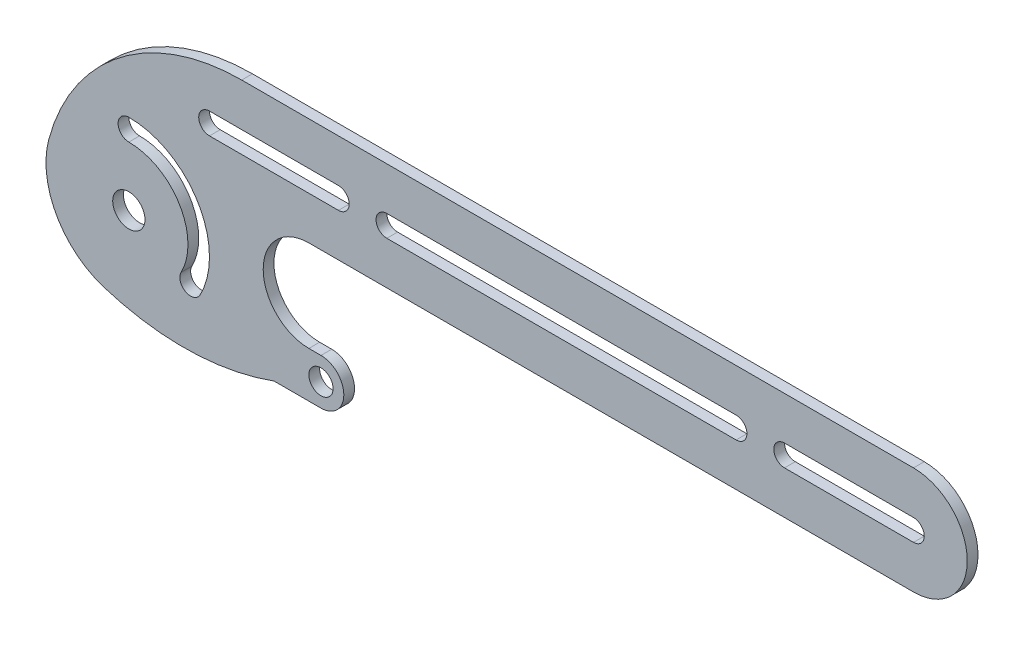
ISO-10303-21;
HEADER;
FILE_DESCRIPTION(('STEP AP214'),'2;1');
FILE_NAME('part.step','',(''),(''),'','','');
FILE_SCHEMA(('AUTOMOTIVE_DESIGN { 1 0 10303 214 1 1 1 1 }'));
ENDSEC;
DATA;
#1=APPLICATION_CONTEXT('core data for automotive mechanical design processes');
#2=APPLICATION_PROTOCOL_DEFINITION('international standard','automotive_design',2000,#1);
#3=PRODUCT_CONTEXT('',#1,'mechanical');
#4=PRODUCT('Part','Part','',(#3));
#5=PRODUCT_RELATED_PRODUCT_CATEGORY('part','',(#4));
#6=PRODUCT_DEFINITION_FORMATION('','',#4);
#7=PRODUCT_DEFINITION_CONTEXT('part definition',#1,'design');
#8=PRODUCT_DEFINITION('design','',#6,#7);
#9=PRODUCT_DEFINITION_SHAPE('','',#8);
#10=(LENGTH_UNIT() NAMED_UNIT(*) SI_UNIT(.MILLI.,.METRE.));
#11=(NAMED_UNIT(*) PLANE_ANGLE_UNIT() SI_UNIT($,.RADIAN.));
#12=(NAMED_UNIT(*) SI_UNIT($,.STERADIAN.) SOLID_ANGLE_UNIT());
#13=UNCERTAINTY_MEASURE_WITH_UNIT(LENGTH_MEASURE(1.E-05),#10,'distance_accuracy_value','');
#14=(GEOMETRIC_REPRESENTATION_CONTEXT(3) GLOBAL_UNCERTAINTY_ASSIGNED_CONTEXT((#13)) GLOBAL_UNIT_ASSIGNED_CONTEXT((#10,
#11,#12)) REPRESENTATION_CONTEXT('',''));
#15=CARTESIAN_POINT('',(0.,0.,0.));
#16=DIRECTION('',(0.,0.,1.));
#17=DIRECTION('',(1.,0.,0.));
#18=AXIS2_PLACEMENT_3D('',#15,#16,#17);
#19=CARTESIAN_POINT('',(21.,-5.67307692307691,1.));
#20=DIRECTION('',(0.,0.,-1.));
#21=DIRECTION('',(-1.,0.,0.));
#22=AXIS2_PLACEMENT_3D('',#19,#20,#21);
#23=PLANE('',#22);
#24=CARTESIAN_POINT('',(122.,21.4999999999999,1.));
#25=DIRECTION('',(0.,0.,1.));
#26=DIRECTION('',(1.,0.,0.));
#27=AXIS2_PLACEMENT_3D('',#24,#25,#26);
#28=CIRCLE('',#27,2.);
#29=CARTESIAN_POINT('',(122.,23.4999999999999,1.));
#30=VERTEX_POINT('',#29);
#31=CARTESIAN_POINT('',(122.,19.5,1.));
#32=VERTEX_POINT('',#31);
#33=EDGE_CURVE('E245',#30,#32,#28,.T.);
#34=ORIENTED_EDGE('',*,*,#33,.F.);
#35=DIRECTION('',(-1.,0.,0.));
#36=VECTOR('',#35,1.);
#37=CARTESIAN_POINT('',(122.,23.4999999999999,1.));
#38=LINE('',#37,#36);
#39=CARTESIAN_POINT('',(146.,23.4999999999999,1.));
#40=VERTEX_POINT('',#39);
#41=EDGE_CURVE('E253',#40,#30,#38,.T.);
#42=ORIENTED_EDGE('',*,*,#41,.F.);
#43=CARTESIAN_POINT('',(146.,21.4999999999999,1.));
#44=DIRECTION('',(0.,0.,1.));
#45=DIRECTION('',(1.,0.,0.));
#46=AXIS2_PLACEMENT_3D('',#43,#44,#45);
#47=CIRCLE('',#46,2.);
#48=CARTESIAN_POINT('',(146.,19.4999999999999,1.));
#49=VERTEX_POINT('',#48);
#50=EDGE_CURVE('E250',#49,#40,#47,.T.);
#51=ORIENTED_EDGE('',*,*,#50,.F.);
#52=DIRECTION('',(1.,0.,0.));
#53=VECTOR('',#52,1.);
#54=CARTESIAN_POINT('',(122.,19.5,1.));
#55=LINE('',#54,#53);
#56=EDGE_CURVE('E247',#32,#49,#55,.T.);
#57=ORIENTED_EDGE('',*,*,#56,.F.);
#58=EDGE_LOOP('',(#34,#42,#51,#57));
#59=FACE_BOUND('',#58,.T.);
#60=CARTESIAN_POINT('',(15.,21.5,1.));
#61=DIRECTION('',(0.,0.,1.));
#62=DIRECTION('',(1.,0.,0.));
#63=AXIS2_PLACEMENT_3D('',#60,#61,#62);
#64=CIRCLE('',#63,2.);
#65=CARTESIAN_POINT('',(15.,23.5,1.));
#66=VERTEX_POINT('',#65);
#67=CARTESIAN_POINT('',(15.,19.5,1.));
#68=VERTEX_POINT('',#67);
#69=EDGE_CURVE('E307',#66,#68,#64,.T.);
#70=ORIENTED_EDGE('',*,*,#69,.F.);
#71=DIRECTION('',(-1.,0.,0.));
#72=VECTOR('',#71,1.);
#73=CARTESIAN_POINT('',(15.,23.5,1.));
#74=LINE('',#73,#72);
#75=CARTESIAN_POINT('',(39.,23.5,1.));
#76=VERTEX_POINT('',#75);
#77=EDGE_CURVE('E315',#76,#66,#74,.T.);
#78=ORIENTED_EDGE('',*,*,#77,.F.);
#79=CARTESIAN_POINT('',(39.,21.5,1.));
#80=DIRECTION('',(0.,0.,1.));
#81=DIRECTION('',(1.,0.,0.));
#82=AXIS2_PLACEMENT_3D('',#79,#80,#81);
#83=CIRCLE('',#82,2.);
#84=CARTESIAN_POINT('',(39.,19.5,1.));
#85=VERTEX_POINT('',#84);
#86=EDGE_CURVE('E312',#85,#76,#83,.T.);
#87=ORIENTED_EDGE('',*,*,#86,.F.);
#88=DIRECTION('',(1.,0.,0.));
#89=VECTOR('',#88,1.);
#90=CARTESIAN_POINT('',(15.,19.5,1.));
#91=LINE('',#90,#89);
#92=EDGE_CURVE('E309',#68,#85,#91,.T.);
#93=ORIENTED_EDGE('',*,*,#92,.F.);
#94=EDGE_LOOP('',(#70,#78,#87,#93));
#95=FACE_BOUND('',#94,.T.);
#96=CARTESIAN_POINT('',(21.,-5.67307692307691,1.));
#97=DIRECTION('',(0.,0.,1.));
#98=DIRECTION('',(-1.,0.,0.));
#99=AXIS2_PLACEMENT_3D('',#96,#97,#98);
#100=CIRCLE('',#99,37.1730769230769);
#101=CARTESIAN_POINT('',(21.,31.5,1.));
#102=VERTEX_POINT('',#101);
#103=CARTESIAN_POINT('',(-14.8866459869329,4.02157561002308,1.));
#104=VERTEX_POINT('',#103);
#105=EDGE_CURVE('E350',#102,#104,#100,.T.);
#106=ORIENTED_EDGE('',*,*,#105,.T.);
#107=CARTESIAN_POINT('',(0.,0.,1.));
#108=DIRECTION('',(0.,0.,1.));
#109=DIRECTION('',(1.,0.,0.));
#110=AXIS2_PLACEMENT_3D('',#107,#108,#109);
#111=CIRCLE('',#110,15.4202885552573);
#112=CARTESIAN_POINT('',(-4.68632225256741,-14.6909388016046,1.));
#113=VERTEX_POINT('',#112);
#114=EDGE_CURVE('E353',#104,#113,#111,.T.);
#115=ORIENTED_EDGE('',*,*,#114,.T.);
#116=CARTESIAN_POINT('',(10.150187696722,31.8193624426165,1.));
#117=DIRECTION('',(0.,0.,1.));
#118=DIRECTION('',(-1.,0.,0.));
#119=AXIS2_PLACEMENT_3D('',#116,#117,#118);
#120=CIRCLE('',#119,48.8193624426165);
#121=CARTESIAN_POINT('',(27.,-14.,1.));
#122=VERTEX_POINT('',#121);
#123=EDGE_CURVE('E356',#113,#122,#120,.T.);
#124=ORIENTED_EDGE('',*,*,#123,.T.);
#125=DIRECTION('',(1.,0.,0.));
#126=VECTOR('',#125,1.);
#127=CARTESIAN_POINT('',(27.,-14.,1.));
#128=LINE('',#127,#126);
#129=CARTESIAN_POINT('',(35.75,-14.,1.));
#130=VERTEX_POINT('',#129);
#131=EDGE_CURVE('E358',#122,#130,#128,.T.);
#132=ORIENTED_EDGE('',*,*,#131,.T.);
#133=CARTESIAN_POINT('',(35.75,-9.75,1.));
#134=DIRECTION('',(0.,0.,1.));
#135=DIRECTION('',(-1.,0.,0.));
#136=AXIS2_PLACEMENT_3D('',#133,#134,#135);
#137=CIRCLE('',#136,4.25);
#138=CARTESIAN_POINT('',(35.75,-5.5,1.));
#139=VERTEX_POINT('',#138);
#140=EDGE_CURVE('E360',#130,#139,#137,.T.);
#141=ORIENTED_EDGE('',*,*,#140,.T.);
#142=DIRECTION('',(-1.,0.,0.));
#143=VECTOR('',#142,1.);
#144=CARTESIAN_POINT('',(33.5,-5.5,1.));
#145=LINE('',#144,#143);
#146=CARTESIAN_POINT('',(33.5,-5.5,1.));
#147=VERTEX_POINT('',#146);
#148=EDGE_CURVE('E362',#139,#147,#145,.T.);
#149=ORIENTED_EDGE('',*,*,#148,.T.);
#150=CARTESIAN_POINT('',(33.5,3.,1.));
#151=DIRECTION('',(0.,0.,-1.));
#152=DIRECTION('',(1.,0.,0.));
#153=AXIS2_PLACEMENT_3D('',#150,#151,#152);
#154=CIRCLE('',#153,8.5);
#155=CARTESIAN_POINT('',(33.5,11.5,1.));
#156=VERTEX_POINT('',#155);
#157=EDGE_CURVE('E364',#147,#156,#154,.T.);
#158=ORIENTED_EDGE('',*,*,#157,.T.);
#159=DIRECTION('',(1.,0.,0.));
#160=VECTOR('',#159,1.);
#161=CARTESIAN_POINT('',(146.,11.4999999999999,1.));
#162=LINE('',#161,#160);
#163=CARTESIAN_POINT('',(146.,11.4999999999999,1.));
#164=VERTEX_POINT('',#163);
#165=EDGE_CURVE('E366',#156,#164,#162,.T.);
#166=ORIENTED_EDGE('',*,*,#165,.T.);
#167=CARTESIAN_POINT('',(146.,21.4999999999999,1.));
#168=DIRECTION('',(0.,0.,1.));
#169=DIRECTION('',(-1.,0.,0.));
#170=AXIS2_PLACEMENT_3D('',#167,#168,#169);
#171=CIRCLE('',#170,10.);
#172=CARTESIAN_POINT('',(146.,31.5,1.));
#173=VERTEX_POINT('',#172);
#174=EDGE_CURVE('E368',#164,#173,#171,.T.);
#175=ORIENTED_EDGE('',*,*,#174,.T.);
#176=DIRECTION('',(-1.,0.,0.));
#177=VECTOR('',#176,1.);
#178=CARTESIAN_POINT('',(21.,31.5,1.));
#179=LINE('',#178,#177);
#180=EDGE_CURVE('E370',#173,#102,#179,.T.);
#181=ORIENTED_EDGE('',*,*,#180,.T.);
#182=EDGE_LOOP('',(#106,#115,#124,#132,#141,#149,#158,#166,#175,#181));
#183=FACE_BOUND('',#182,.T.);
#184=CARTESIAN_POINT('',(35.75,-9.75,1.));
#185=DIRECTION('',(0.,0.,1.));
#186=DIRECTION('',(1.,0.,0.));
#187=AXIS2_PLACEMENT_3D('',#184,#185,#186);
#188=CIRCLE('',#187,2.25);
#189=CARTESIAN_POINT('',(38.,-9.75,1.));
#190=VERTEX_POINT('',#189);
#191=EDGE_CURVE('E344',#190,#190,#188,.T.);
#192=ORIENTED_EDGE('',*,*,#191,.F.);
#193=EDGE_LOOP('',(#192));
#194=FACE_BOUND('',#193,.T.);
#195=CARTESIAN_POINT('',(0.,0.,1.));
#196=DIRECTION('',(0.,0.,1.));
#197=DIRECTION('',(1.,0.,0.));
#198=AXIS2_PLACEMENT_3D('',#195,#196,#197);
#199=CIRCLE('',#198,3.);
#200=CARTESIAN_POINT('',(3.,0.,1.));
#201=VERTEX_POINT('',#200);
#202=EDGE_CURVE('E338',#201,#201,#199,.T.);
#203=ORIENTED_EDGE('',*,*,#202,.F.);
#204=EDGE_LOOP('',(#203));
#205=FACE_BOUND('',#204,.T.);
#206=CARTESIAN_POINT('',(48.,21.5,1.));
#207=DIRECTION('',(0.,0.,1.));
#208=DIRECTION('',(1.,0.,0.));
#209=AXIS2_PLACEMENT_3D('',#206,#207,#208);
#210=CIRCLE('',#209,2.);
#211=CARTESIAN_POINT('',(48.,23.5,1.));
#212=VERTEX_POINT('',#211);
#213=CARTESIAN_POINT('',(48.,19.5,1.));
#214=VERTEX_POINT('',#213);
#215=EDGE_CURVE('E276',#212,#214,#210,.T.);
#216=ORIENTED_EDGE('',*,*,#215,.F.);
#217=DIRECTION('',(-1.,0.,0.));
#218=VECTOR('',#217,1.);
#219=CARTESIAN_POINT('',(48.,23.5,1.));
#220=LINE('',#219,#218);
#221=CARTESIAN_POINT('',(113.,23.5,1.));
#222=VERTEX_POINT('',#221);
#223=EDGE_CURVE('E284',#222,#212,#220,.T.);
#224=ORIENTED_EDGE('',*,*,#223,.F.);
#225=CARTESIAN_POINT('',(113.,21.4999999999999,1.));
#226=DIRECTION('',(0.,0.,1.));
#227=DIRECTION('',(1.,0.,0.));
#228=AXIS2_PLACEMENT_3D('',#225,#226,#227);
#229=CIRCLE('',#228,2.);
#230=CARTESIAN_POINT('',(113.,19.4999999999999,1.));
#231=VERTEX_POINT('',#230);
#232=EDGE_CURVE('E281',#231,#222,#229,.T.);
#233=ORIENTED_EDGE('',*,*,#232,.F.);
#234=DIRECTION('',(1.,0.,0.));
#235=VECTOR('',#234,1.);
#236=CARTESIAN_POINT('',(48.,19.5,1.));
#237=LINE('',#236,#235);
#238=EDGE_CURVE('E278',#214,#231,#237,.T.);
#239=ORIENTED_EDGE('',*,*,#238,.F.);
#240=EDGE_LOOP('',(#216,#224,#233,#239));
#241=FACE_BOUND('',#240,.T.);
#242=CARTESIAN_POINT('',(11.4976326065654,-6.06666666666667,1.));
#243=DIRECTION('',(0.,0.,1.));
#244=DIRECTION('',(1.,0.,0.));
#245=AXIS2_PLACEMENT_3D('',#242,#243,#244);
#246=CIRCLE('',#245,2.);
#247=CARTESIAN_POINT('',(9.72876605170917,-5.13333333333334,1.));
#248=VERTEX_POINT('',#247);
#249=CARTESIAN_POINT('',(13.2664991614216,-7.,1.));
#250=VERTEX_POINT('',#249);
#251=EDGE_CURVE('E209',#248,#250,#246,.T.);
#252=ORIENTED_EDGE('',*,*,#251,.F.);
#253=CARTESIAN_POINT('',(0.,0.,1.));
#254=DIRECTION('',(0.,0.,-1.));
#255=DIRECTION('',(1.,0.,0.));
#256=AXIS2_PLACEMENT_3D('',#253,#254,#255);
#257=CIRCLE('',#256,11.);
#258=CARTESIAN_POINT('',(0.,11.,1.));
#259=VERTEX_POINT('',#258);
#260=EDGE_CURVE('E231',#259,#248,#257,.T.);
#261=ORIENTED_EDGE('',*,*,#260,.F.);
#262=CARTESIAN_POINT('',(0.,13.,1.));
#263=DIRECTION('',(0.,0.,1.));
#264=DIRECTION('',(1.,0.,0.));
#265=AXIS2_PLACEMENT_3D('',#262,#263,#264);
#266=CIRCLE('',#265,2.);
#267=CARTESIAN_POINT('',(0.,15.,1.));
#268=VERTEX_POINT('',#267);
#269=EDGE_CURVE('E229',#268,#259,#266,.T.);
#270=ORIENTED_EDGE('',*,*,#269,.F.);
#271=CARTESIAN_POINT('',(0.,0.,1.));
#272=DIRECTION('',(0.,0.,1.));
#273=DIRECTION('',(1.,0.,0.));
#274=AXIS2_PLACEMENT_3D('',#271,#272,#273);
#275=CIRCLE('',#274,15.);
#276=EDGE_CURVE('E217',#250,#268,#275,.T.);
#277=ORIENTED_EDGE('',*,*,#276,.F.);
#278=EDGE_LOOP('',(#252,#261,#270,#277));
#279=FACE_BOUND('',#278,.T.);
#280=ADVANCED_FACE('F36',(#59,#95,#183,#194,#205,#241,#279),#23,.F.);
#281=CARTESIAN_POINT('',(21.,-5.67307692307691,-1.));
#282=DIRECTION('',(0.,0.,-1.));
#283=DIRECTION('',(-1.,0.,0.));
#284=AXIS2_PLACEMENT_3D('',#281,#282,#283);
#285=PLANE('',#284);
#286=CARTESIAN_POINT('',(35.75,-9.75,-1.));
#287=DIRECTION('',(0.,0.,1.));
#288=DIRECTION('',(1.,0.,0.));
#289=AXIS2_PLACEMENT_3D('',#286,#287,#288);
#290=CIRCLE('',#289,2.25);
#291=CARTESIAN_POINT('',(38.,-9.75,-1.));
#292=VERTEX_POINT('',#291);
#293=EDGE_CURVE('E341',#292,#292,#290,.T.);
#294=ORIENTED_EDGE('',*,*,#293,.T.);
#295=EDGE_LOOP('',(#294));
#296=FACE_BOUND('',#295,.T.);
#297=CARTESIAN_POINT('',(21.,-5.67307692307691,-1.));
#298=DIRECTION('',(0.,0.,1.));
#299=DIRECTION('',(-1.,0.,0.));
#300=AXIS2_PLACEMENT_3D('',#297,#298,#299);
#301=CIRCLE('',#300,37.1730769230769);
#302=CARTESIAN_POINT('',(21.,31.5,-1.));
#303=VERTEX_POINT('',#302);
#304=CARTESIAN_POINT('',(-14.8866459869329,4.02157561002308,-1.));
#305=VERTEX_POINT('',#304);
#306=EDGE_CURVE('E347',#303,#305,#301,.T.);
#307=ORIENTED_EDGE('',*,*,#306,.F.);
#308=DIRECTION('',(-1.,0.,0.));
#309=VECTOR('',#308,1.);
#310=CARTESIAN_POINT('',(21.,31.5,-1.));
#311=LINE('',#310,#309);
#312=CARTESIAN_POINT('',(146.,31.5,-1.));
#313=VERTEX_POINT('',#312);
#314=EDGE_CURVE('E354',#313,#303,#311,.T.);
#315=ORIENTED_EDGE('',*,*,#314,.F.);
#316=CARTESIAN_POINT('',(146.,21.4999999999999,-1.));
#317=DIRECTION('',(0.,0.,1.));
#318=DIRECTION('',(-1.,0.,0.));
#319=AXIS2_PLACEMENT_3D('',#316,#317,#318);
#320=CIRCLE('',#319,10.);
#321=CARTESIAN_POINT('',(146.,11.4999999999999,-1.));
#322=VERTEX_POINT('',#321);
#323=EDGE_CURVE('E389',#322,#313,#320,.T.);
#324=ORIENTED_EDGE('',*,*,#323,.F.);
#325=DIRECTION('',(1.,0.,0.));
#326=VECTOR('',#325,1.);
#327=CARTESIAN_POINT('',(146.,11.4999999999999,-1.));
#328=LINE('',#327,#326);
#329=CARTESIAN_POINT('',(33.5,11.5,-1.));
#330=VERTEX_POINT('',#329);
#331=EDGE_CURVE('E387',#330,#322,#328,.T.);
#332=ORIENTED_EDGE('',*,*,#331,.F.);
#333=CARTESIAN_POINT('',(33.5,3.,-1.));
#334=DIRECTION('',(0.,0.,-1.));
#335=DIRECTION('',(1.,0.,0.));
#336=AXIS2_PLACEMENT_3D('',#333,#334,#335);
#337=CIRCLE('',#336,8.5);
#338=CARTESIAN_POINT('',(33.5,-5.5,-1.));
#339=VERTEX_POINT('',#338);
#340=EDGE_CURVE('E385',#339,#330,#337,.T.);
#341=ORIENTED_EDGE('',*,*,#340,.F.);
#342=DIRECTION('',(-1.,0.,0.));
#343=VECTOR('',#342,1.);
#344=CARTESIAN_POINT('',(33.5,-5.5,-1.));
#345=LINE('',#344,#343);
#346=CARTESIAN_POINT('',(35.75,-5.5,-1.));
#347=VERTEX_POINT('',#346);
#348=EDGE_CURVE('E383',#347,#339,#345,.T.);
#349=ORIENTED_EDGE('',*,*,#348,.F.);
#350=CARTESIAN_POINT('',(35.75,-9.75,-1.));
#351=DIRECTION('',(0.,0.,1.));
#352=DIRECTION('',(-1.,0.,0.));
#353=AXIS2_PLACEMENT_3D('',#350,#351,#352);
#354=CIRCLE('',#353,4.25);
#355=CARTESIAN_POINT('',(35.75,-14.,-1.));
#356=VERTEX_POINT('',#355);
#357=EDGE_CURVE('E381',#356,#347,#354,.T.);
#358=ORIENTED_EDGE('',*,*,#357,.F.);
#359=DIRECTION('',(1.,0.,0.));
#360=VECTOR('',#359,1.);
#361=CARTESIAN_POINT('',(27.,-14.,-1.));
#362=LINE('',#361,#360);
#363=CARTESIAN_POINT('',(27.,-14.,-1.));
#364=VERTEX_POINT('',#363);
#365=EDGE_CURVE('E379',#364,#356,#362,.T.);
#366=ORIENTED_EDGE('',*,*,#365,.F.);
#367=CARTESIAN_POINT('',(10.150187696722,31.8193624426165,-1.));
#368=DIRECTION('',(0.,0.,1.));
#369=DIRECTION('',(-1.,0.,0.));
#370=AXIS2_PLACEMENT_3D('',#367,#368,#369);
#371=CIRCLE('',#370,48.8193624426165);
#372=CARTESIAN_POINT('',(-4.68632225256741,-14.6909388016046,-1.));
#373=VERTEX_POINT('',#372);
#374=EDGE_CURVE('E377',#373,#364,#371,.T.);
#375=ORIENTED_EDGE('',*,*,#374,.F.);
#376=CARTESIAN_POINT('',(0.,0.,-1.));
#377=DIRECTION('',(0.,0.,1.));
#378=DIRECTION('',(1.,0.,0.));
#379=AXIS2_PLACEMENT_3D('',#376,#377,#378);
#380=CIRCLE('',#379,15.4202885552573);
#381=EDGE_CURVE('E375',#305,#373,#380,.T.);
#382=ORIENTED_EDGE('',*,*,#381,.F.);
#383=EDGE_LOOP('',(#307,#315,#324,#332,#341,#349,#358,#366,#375,#382));
#384=FACE_BOUND('',#383,.T.);
#385=CARTESIAN_POINT('',(0.,0.,-1.));
#386=DIRECTION('',(0.,0.,1.));
#387=DIRECTION('',(1.,0.,0.));
#388=AXIS2_PLACEMENT_3D('',#385,#386,#387);
#389=CIRCLE('',#388,3.);
#390=CARTESIAN_POINT('',(3.,0.,-1.));
#391=VERTEX_POINT('',#390);
#392=EDGE_CURVE('E337',#391,#391,#389,.T.);
#393=ORIENTED_EDGE('',*,*,#392,.T.);
#394=EDGE_LOOP('',(#393));
#395=FACE_BOUND('',#394,.T.);
#396=DIRECTION('',(-1.,0.,0.));
#397=VECTOR('',#396,1.);
#398=CARTESIAN_POINT('',(15.,23.5,-1.));
#399=LINE('',#398,#397);
#400=CARTESIAN_POINT('',(39.,23.5,-1.));
#401=VERTEX_POINT('',#400);
#402=CARTESIAN_POINT('',(15.,23.5,-1.));
#403=VERTEX_POINT('',#402);
#404=EDGE_CURVE('E310',#401,#403,#399,.T.);
#405=ORIENTED_EDGE('',*,*,#404,.T.);
#406=CARTESIAN_POINT('',(15.,21.5,-1.));
#407=DIRECTION('',(0.,0.,1.));
#408=DIRECTION('',(1.,0.,0.));
#409=AXIS2_PLACEMENT_3D('',#406,#407,#408);
#410=CIRCLE('',#409,2.);
#411=CARTESIAN_POINT('',(15.,19.5,-1.));
#412=VERTEX_POINT('',#411);
#413=EDGE_CURVE('E306',#403,#412,#410,.T.);
#414=ORIENTED_EDGE('',*,*,#413,.T.);
#415=DIRECTION('',(1.,0.,0.));
#416=VECTOR('',#415,1.);
#417=CARTESIAN_POINT('',(15.,19.5,-1.));
#418=LINE('',#417,#416);
#419=CARTESIAN_POINT('',(39.,19.5,-1.));
#420=VERTEX_POINT('',#419);
#421=EDGE_CURVE('E320',#412,#420,#418,.T.);
#422=ORIENTED_EDGE('',*,*,#421,.T.);
#423=CARTESIAN_POINT('',(39.,21.5,-1.));
#424=DIRECTION('',(0.,0.,1.));
#425=DIRECTION('',(1.,0.,0.));
#426=AXIS2_PLACEMENT_3D('',#423,#424,#425);
#427=CIRCLE('',#426,2.);
#428=EDGE_CURVE('E323',#420,#401,#427,.T.);
#429=ORIENTED_EDGE('',*,*,#428,.T.);
#430=EDGE_LOOP('',(#405,#414,#422,#429));
#431=FACE_BOUND('',#430,.T.);
#432=DIRECTION('',(-1.,0.,0.));
#433=VECTOR('',#432,1.);
#434=CARTESIAN_POINT('',(48.,23.5,-1.));
#435=LINE('',#434,#433);
#436=CARTESIAN_POINT('',(113.,23.5,-1.));
#437=VERTEX_POINT('',#436);
#438=CARTESIAN_POINT('',(48.,23.5,-1.));
#439=VERTEX_POINT('',#438);
#440=EDGE_CURVE('E279',#437,#439,#435,.T.);
#441=ORIENTED_EDGE('',*,*,#440,.T.);
#442=CARTESIAN_POINT('',(48.,21.5,-1.));
#443=DIRECTION('',(0.,0.,1.));
#444=DIRECTION('',(1.,0.,0.));
#445=AXIS2_PLACEMENT_3D('',#442,#443,#444);
#446=CIRCLE('',#445,2.);
#447=CARTESIAN_POINT('',(48.,19.5,-1.));
#448=VERTEX_POINT('',#447);
#449=EDGE_CURVE('E275',#439,#448,#446,.T.);
#450=ORIENTED_EDGE('',*,*,#449,.T.);
#451=DIRECTION('',(1.,0.,0.));
#452=VECTOR('',#451,1.);
#453=CARTESIAN_POINT('',(48.,19.5,-1.));
#454=LINE('',#453,#452);
#455=CARTESIAN_POINT('',(113.,19.4999999999999,-1.));
#456=VERTEX_POINT('',#455);
#457=EDGE_CURVE('E289',#448,#456,#454,.T.);
#458=ORIENTED_EDGE('',*,*,#457,.T.);
#459=CARTESIAN_POINT('',(113.,21.4999999999999,-1.));
#460=DIRECTION('',(0.,0.,1.));
#461=DIRECTION('',(1.,0.,0.));
#462=AXIS2_PLACEMENT_3D('',#459,#460,#461);
#463=CIRCLE('',#462,2.);
#464=EDGE_CURVE('E292',#456,#437,#463,.T.);
#465=ORIENTED_EDGE('',*,*,#464,.T.);
#466=EDGE_LOOP('',(#441,#450,#458,#465));
#467=FACE_BOUND('',#466,.T.);
#468=DIRECTION('',(-1.,0.,0.));
#469=VECTOR('',#468,1.);
#470=CARTESIAN_POINT('',(122.,23.4999999999999,-1.));
#471=LINE('',#470,#469);
#472=CARTESIAN_POINT('',(146.,23.4999999999999,-1.));
#473=VERTEX_POINT('',#472);
#474=CARTESIAN_POINT('',(122.,23.4999999999999,-1.));
#475=VERTEX_POINT('',#474);
#476=EDGE_CURVE('E248',#473,#475,#471,.T.);
#477=ORIENTED_EDGE('',*,*,#476,.T.);
#478=CARTESIAN_POINT('',(122.,21.4999999999999,-1.));
#479=DIRECTION('',(0.,0.,1.));
#480=DIRECTION('',(1.,0.,0.));
#481=AXIS2_PLACEMENT_3D('',#478,#479,#480);
#482=CIRCLE('',#481,2.);
#483=CARTESIAN_POINT('',(122.,19.5,-1.));
#484=VERTEX_POINT('',#483);
#485=EDGE_CURVE('E225',#475,#484,#482,.T.);
#486=ORIENTED_EDGE('',*,*,#485,.T.);
#487=DIRECTION('',(1.,0.,0.));
#488=VECTOR('',#487,1.);
#489=CARTESIAN_POINT('',(122.,19.5,-1.));
#490=LINE('',#489,#488);
#491=CARTESIAN_POINT('',(146.,19.4999999999999,-1.));
#492=VERTEX_POINT('',#491);
#493=EDGE_CURVE('E258',#484,#492,#490,.T.);
#494=ORIENTED_EDGE('',*,*,#493,.T.);
#495=CARTESIAN_POINT('',(146.,21.4999999999999,-1.));
#496=DIRECTION('',(0.,0.,1.));
#497=DIRECTION('',(1.,0.,0.));
#498=AXIS2_PLACEMENT_3D('',#495,#496,#497);
#499=CIRCLE('',#498,2.);
#500=EDGE_CURVE('E261',#492,#473,#499,.T.);
#501=ORIENTED_EDGE('',*,*,#500,.T.);
#502=EDGE_LOOP('',(#477,#486,#494,#501));
#503=FACE_BOUND('',#502,.T.);
#504=CARTESIAN_POINT('',(0.,0.,-1.));
#505=DIRECTION('',(0.,0.,-1.));
#506=DIRECTION('',(1.,0.,0.));
#507=AXIS2_PLACEMENT_3D('',#504,#505,#506);
#508=CIRCLE('',#507,11.);
#509=CARTESIAN_POINT('',(0.,11.,-1.));
#510=VERTEX_POINT('',#509);
#511=CARTESIAN_POINT('',(9.72876605170917,-5.13333333333334,-1.));
#512=VERTEX_POINT('',#511);
#513=EDGE_CURVE('E218',#510,#512,#508,.T.);
#514=ORIENTED_EDGE('',*,*,#513,.T.);
#515=CARTESIAN_POINT('',(11.4976326065654,-6.06666666666667,-1.));
#516=DIRECTION('',(0.,0.,1.));
#517=DIRECTION('',(1.,0.,0.));
#518=AXIS2_PLACEMENT_3D('',#515,#516,#517);
#519=CIRCLE('',#518,2.);
#520=CARTESIAN_POINT('',(13.2664991614216,-7.,-1.));
#521=VERTEX_POINT('',#520);
#522=EDGE_CURVE('E59',#512,#521,#519,.T.);
#523=ORIENTED_EDGE('',*,*,#522,.T.);
#524=CARTESIAN_POINT('',(0.,0.,-1.));
#525=DIRECTION('',(0.,0.,1.));
#526=DIRECTION('',(1.,0.,0.));
#527=AXIS2_PLACEMENT_3D('',#524,#525,#526);
#528=CIRCLE('',#527,15.);
#529=CARTESIAN_POINT('',(0.,15.,-1.));
#530=VERTEX_POINT('',#529);
#531=EDGE_CURVE('E224',#521,#530,#528,.T.);
#532=ORIENTED_EDGE('',*,*,#531,.T.);
#533=CARTESIAN_POINT('',(0.,13.,-1.));
#534=DIRECTION('',(0.,0.,1.));
#535=DIRECTION('',(1.,0.,0.));
#536=AXIS2_PLACEMENT_3D('',#533,#534,#535);
#537=CIRCLE('',#536,2.);
#538=EDGE_CURVE('E237',#530,#510,#537,.T.);
#539=ORIENTED_EDGE('',*,*,#538,.T.);
#540=EDGE_LOOP('',(#514,#523,#532,#539));
#541=FACE_BOUND('',#540,.T.);
#542=ADVANCED_FACE('F425',(#296,#384,#395,#431,#467,#503,#541),#285,.T.);
#543=CARTESIAN_POINT('',(21.,-5.67307692307691,1.));
#544=DIRECTION('',(0.,0.,-1.));
#545=DIRECTION('',(-1.,0.,0.));
#546=AXIS2_PLACEMENT_3D('',#543,#544,#545);
#547=CYLINDRICAL_SURFACE('',#546,37.1730769230769);
#548=ORIENTED_EDGE('',*,*,#306,.T.);
#549=DIRECTION('',(0.,0.,-1.));
#550=VECTOR('',#549,1.);
#551=CARTESIAN_POINT('',(-14.8866459869329,4.02157561002308,1.));
#552=LINE('',#551,#550);
#553=EDGE_CURVE('E11',#104,#305,#552,.T.);
#554=ORIENTED_EDGE('',*,*,#553,.F.);
#555=ORIENTED_EDGE('',*,*,#105,.F.);
#556=DIRECTION('',(0.,0.,-1.));
#557=VECTOR('',#556,1.);
#558=CARTESIAN_POINT('',(21.,31.5,1.));
#559=LINE('',#558,#557);
#560=EDGE_CURVE('E372',#102,#303,#559,.T.);
#561=ORIENTED_EDGE('',*,*,#560,.T.);
#562=EDGE_LOOP('',(#548,#554,#555,#561));
#563=FACE_BOUND('',#562,.T.);
#564=ADVANCED_FACE('F38',(#563),#547,.T.);
#565=CARTESIAN_POINT('',(0.,0.,1.));
#566=DIRECTION('',(0.,0.,-1.));
#567=DIRECTION('',(-1.,0.,0.));
#568=AXIS2_PLACEMENT_3D('',#565,#566,#567);
#569=CYLINDRICAL_SURFACE('',#568,15.4202885552573);
#570=ORIENTED_EDGE('',*,*,#381,.T.);
#571=DIRECTION('',(0.,0.,-1.));
#572=VECTOR('',#571,1.);
#573=CARTESIAN_POINT('',(-4.68632225256741,-14.6909388016046,1.));
#574=LINE('',#573,#572);
#575=EDGE_CURVE('E44',#113,#373,#574,.T.);
#576=ORIENTED_EDGE('',*,*,#575,.F.);
#577=ORIENTED_EDGE('',*,*,#114,.F.);
#578=ORIENTED_EDGE('',*,*,#553,.T.);
#579=EDGE_LOOP('',(#570,#576,#577,#578));
#580=FACE_BOUND('',#579,.T.);
#581=ADVANCED_FACE('F443',(#580),#569,.T.);
#582=CARTESIAN_POINT('',(10.150187696722,31.8193624426165,1.));
#583=DIRECTION('',(0.,0.,-1.));
#584=DIRECTION('',(-1.,0.,0.));
#585=AXIS2_PLACEMENT_3D('',#582,#583,#584);
#586=CYLINDRICAL_SURFACE('',#585,48.8193624426165);
#587=ORIENTED_EDGE('',*,*,#374,.T.);
#588=DIRECTION('',(0.,0.,-1.));
#589=VECTOR('',#588,1.);
#590=CARTESIAN_POINT('',(27.,-14.,1.));
#591=LINE('',#590,#589);
#592=EDGE_CURVE('E412',#122,#364,#591,.T.);
#593=ORIENTED_EDGE('',*,*,#592,.F.);
#594=ORIENTED_EDGE('',*,*,#123,.F.);
#595=ORIENTED_EDGE('',*,*,#575,.T.);
#596=EDGE_LOOP('',(#587,#593,#594,#595));
#597=FACE_BOUND('',#596,.T.);
#598=ADVANCED_FACE('F419',(#597),#586,.T.);
#599=CARTESIAN_POINT('',(27.,-14.,1.));
#600=DIRECTION('',(0.,1.,0.));
#601=DIRECTION('',(0.,0.,1.));
#602=AXIS2_PLACEMENT_3D('',#599,#600,#601);
#603=PLANE('',#602);
#604=ORIENTED_EDGE('',*,*,#365,.T.);
#605=DIRECTION('',(0.,0.,-1.));
#606=VECTOR('',#605,1.);
#607=CARTESIAN_POINT('',(35.75,-14.,1.));
#608=LINE('',#607,#606);
#609=EDGE_CURVE('E409',#130,#356,#608,.T.);
#610=ORIENTED_EDGE('',*,*,#609,.F.);
#611=ORIENTED_EDGE('',*,*,#131,.F.);
#612=ORIENTED_EDGE('',*,*,#592,.T.);
#613=EDGE_LOOP('',(#604,#610,#611,#612));
#614=FACE_BOUND('',#613,.T.);
#615=ADVANCED_FACE('F431',(#614),#603,.F.);
#616=CARTESIAN_POINT('',(35.75,-9.75,1.));
#617=DIRECTION('',(0.,0.,-1.));
#618=DIRECTION('',(-1.,0.,0.));
#619=AXIS2_PLACEMENT_3D('',#616,#617,#618);
#620=CYLINDRICAL_SURFACE('',#619,4.25);
#621=ORIENTED_EDGE('',*,*,#357,.T.);
#622=DIRECTION('',(0.,0.,-1.));
#623=VECTOR('',#622,1.);
#624=CARTESIAN_POINT('',(35.75,-5.5,1.));
#625=LINE('',#624,#623);
#626=EDGE_CURVE('E406',#139,#347,#625,.T.);
#627=ORIENTED_EDGE('',*,*,#626,.F.);
#628=ORIENTED_EDGE('',*,*,#140,.F.);
#629=ORIENTED_EDGE('',*,*,#609,.T.);
#630=EDGE_LOOP('',(#621,#627,#628,#629));
#631=FACE_BOUND('',#630,.T.);
#632=ADVANCED_FACE('F435',(#631),#620,.T.);
#633=CARTESIAN_POINT('',(33.5,-5.5,1.));
#634=DIRECTION('',(0.,-1.,0.));
#635=DIRECTION('',(1.,0.,0.));
#636=AXIS2_PLACEMENT_3D('',#633,#634,#635);
#637=PLANE('',#636);
#638=ORIENTED_EDGE('',*,*,#348,.T.);
#639=DIRECTION('',(0.,0.,-1.));
#640=VECTOR('',#639,1.);
#641=CARTESIAN_POINT('',(33.5,-5.5,1.));
#642=LINE('',#641,#640);
#643=EDGE_CURVE('E403',#147,#339,#642,.T.);
#644=ORIENTED_EDGE('',*,*,#643,.F.);
#645=ORIENTED_EDGE('',*,*,#148,.F.);
#646=ORIENTED_EDGE('',*,*,#626,.T.);
#647=EDGE_LOOP('',(#638,#644,#645,#646));
#648=FACE_BOUND('',#647,.T.);
#649=ADVANCED_FACE('F466',(#648),#637,.F.);
#650=CARTESIAN_POINT('',(33.5,3.,1.));
#651=DIRECTION('',(0.,0.,-1.));
#652=DIRECTION('',(-1.,0.,0.));
#653=AXIS2_PLACEMENT_3D('',#650,#651,#652);
#654=CYLINDRICAL_SURFACE('',#653,8.5);
#655=ORIENTED_EDGE('',*,*,#340,.T.);
#656=DIRECTION('',(0.,0.,-1.));
#657=VECTOR('',#656,1.);
#658=CARTESIAN_POINT('',(33.5,11.5,1.));
#659=LINE('',#658,#657);
#660=EDGE_CURVE('E400',#156,#330,#659,.T.);
#661=ORIENTED_EDGE('',*,*,#660,.F.);
#662=ORIENTED_EDGE('',*,*,#157,.F.);
#663=ORIENTED_EDGE('',*,*,#643,.T.);
#664=EDGE_LOOP('',(#655,#661,#662,#663));
#665=FACE_BOUND('',#664,.T.);
#666=ADVANCED_FACE('F463',(#665),#654,.F.);
#667=CARTESIAN_POINT('',(146.,11.4999999999999,1.));
#668=DIRECTION('',(0.,1.,0.));
#669=DIRECTION('',(-1.,0.,0.));
#670=AXIS2_PLACEMENT_3D('',#667,#668,#669);
#671=PLANE('',#670);
#672=ORIENTED_EDGE('',*,*,#331,.T.);
#673=DIRECTION('',(0.,0.,-1.));
#674=VECTOR('',#673,1.);
#675=CARTESIAN_POINT('',(146.,11.4999999999999,1.));
#676=LINE('',#675,#674);
#677=EDGE_CURVE('E397',#164,#322,#676,.T.);
#678=ORIENTED_EDGE('',*,*,#677,.F.);
#679=ORIENTED_EDGE('',*,*,#165,.F.);
#680=ORIENTED_EDGE('',*,*,#660,.T.);
#681=EDGE_LOOP('',(#672,#678,#679,#680));
#682=FACE_BOUND('',#681,.T.);
#683=ADVANCED_FACE('F459',(#682),#671,.F.);
#684=CARTESIAN_POINT('',(146.,21.4999999999999,1.));
#685=DIRECTION('',(0.,0.,-1.));
#686=DIRECTION('',(-1.,0.,0.));
#687=AXIS2_PLACEMENT_3D('',#684,#685,#686);
#688=CYLINDRICAL_SURFACE('',#687,10.);
#689=ORIENTED_EDGE('',*,*,#323,.T.);
#690=DIRECTION('',(0.,0.,-1.));
#691=VECTOR('',#690,1.);
#692=CARTESIAN_POINT('',(146.,31.5,1.));
#693=LINE('',#692,#691);
#694=EDGE_CURVE('E394',#173,#313,#693,.T.);
#695=ORIENTED_EDGE('',*,*,#694,.F.);
#696=ORIENTED_EDGE('',*,*,#174,.F.);
#697=ORIENTED_EDGE('',*,*,#677,.T.);
#698=EDGE_LOOP('',(#689,#695,#696,#697));
#699=FACE_BOUND('',#698,.T.);
#700=ADVANCED_FACE('F455',(#699),#688,.T.);
#701=CARTESIAN_POINT('',(21.,31.5,1.));
#702=DIRECTION('',(0.,-1.,0.));
#703=DIRECTION('',(1.,0.,0.));
#704=AXIS2_PLACEMENT_3D('',#701,#702,#703);
#705=PLANE('',#704);
#706=ORIENTED_EDGE('',*,*,#314,.T.);
#707=ORIENTED_EDGE('',*,*,#560,.F.);
#708=ORIENTED_EDGE('',*,*,#180,.F.);
#709=ORIENTED_EDGE('',*,*,#694,.T.);
#710=EDGE_LOOP('',(#706,#707,#708,#709));
#711=FACE_BOUND('',#710,.T.);
#712=ADVANCED_FACE('F450',(#711),#705,.F.);
#713=CARTESIAN_POINT('',(35.75,-9.75,1.));
#714=DIRECTION('',(0.,0.,-1.));
#715=DIRECTION('',(-1.,0.,0.));
#716=AXIS2_PLACEMENT_3D('',#713,#714,#715);
#717=CYLINDRICAL_SURFACE('',#716,2.25);
#718=ORIENTED_EDGE('',*,*,#191,.T.);
#719=EDGE_LOOP('',(#718));
#720=FACE_BOUND('',#719,.T.);
#721=ORIENTED_EDGE('',*,*,#293,.F.);
#722=EDGE_LOOP('',(#721));
#723=FACE_BOUND('',#722,.T.);
#724=ADVANCED_FACE('F486',(#720,#723),#717,.F.);
#725=CARTESIAN_POINT('',(0.,0.,1.));
#726=DIRECTION('',(0.,0.,-1.));
#727=DIRECTION('',(-1.,0.,0.));
#728=AXIS2_PLACEMENT_3D('',#725,#726,#727);
#729=CYLINDRICAL_SURFACE('',#728,3.);
#730=ORIENTED_EDGE('',*,*,#202,.T.);
#731=EDGE_LOOP('',(#730));
#732=FACE_BOUND('',#731,.T.);
#733=ORIENTED_EDGE('',*,*,#392,.F.);
#734=EDGE_LOOP('',(#733));
#735=FACE_BOUND('',#734,.T.);
#736=ADVANCED_FACE('F512',(#732,#735),#729,.F.);
#737=CARTESIAN_POINT('',(15.,21.5,1.));
#738=DIRECTION('',(0.,0.,-1.));
#739=DIRECTION('',(-1.,0.,0.));
#740=AXIS2_PLACEMENT_3D('',#737,#738,#739);
#741=CYLINDRICAL_SURFACE('',#740,2.);
#742=ORIENTED_EDGE('',*,*,#413,.F.);
#743=DIRECTION('',(0.,0.,-1.));
#744=VECTOR('',#743,1.);
#745=CARTESIAN_POINT('',(15.,23.5,1.));
#746=LINE('',#745,#744);
#747=EDGE_CURVE('E317',#66,#403,#746,.T.);
#748=ORIENTED_EDGE('',*,*,#747,.F.);
#749=ORIENTED_EDGE('',*,*,#69,.T.);
#750=DIRECTION('',(0.,0.,-1.));
#751=VECTOR('',#750,1.);
#752=CARTESIAN_POINT('',(15.,19.5,1.));
#753=LINE('',#752,#751);
#754=EDGE_CURVE('E334',#68,#412,#753,.T.);
#755=ORIENTED_EDGE('',*,*,#754,.T.);
#756=EDGE_LOOP('',(#742,#748,#749,#755));
#757=FACE_BOUND('',#756,.T.);
#758=ADVANCED_FACE('F519',(#757),#741,.F.);
#759=CARTESIAN_POINT('',(15.,19.5,1.));
#760=DIRECTION('',(0.,1.,0.));
#761=DIRECTION('',(0.,0.,1.));
#762=AXIS2_PLACEMENT_3D('',#759,#760,#761);
#763=PLANE('',#762);
#764=ORIENTED_EDGE('',*,*,#421,.F.);
#765=ORIENTED_EDGE('',*,*,#754,.F.);
#766=ORIENTED_EDGE('',*,*,#92,.T.);
#767=DIRECTION('',(0.,0.,-1.));
#768=VECTOR('',#767,1.);
#769=CARTESIAN_POINT('',(39.,19.5,1.));
#770=LINE('',#769,#768);
#771=EDGE_CURVE('E332',#85,#420,#770,.T.);
#772=ORIENTED_EDGE('',*,*,#771,.T.);
#773=EDGE_LOOP('',(#764,#765,#766,#772));
#774=FACE_BOUND('',#773,.T.);
#775=ADVANCED_FACE('F526',(#774),#763,.T.);
#776=CARTESIAN_POINT('',(39.,21.5,1.));
#777=DIRECTION('',(0.,0.,-1.));
#778=DIRECTION('',(-1.,0.,0.));
#779=AXIS2_PLACEMENT_3D('',#776,#777,#778);
#780=CYLINDRICAL_SURFACE('',#779,2.);
#781=ORIENTED_EDGE('',*,*,#428,.F.);
#782=ORIENTED_EDGE('',*,*,#771,.F.);
#783=ORIENTED_EDGE('',*,*,#86,.T.);
#784=DIRECTION('',(0.,0.,-1.));
#785=VECTOR('',#784,1.);
#786=CARTESIAN_POINT('',(39.,23.5,1.));
#787=LINE('',#786,#785);
#788=EDGE_CURVE('E330',#76,#401,#787,.T.);
#789=ORIENTED_EDGE('',*,*,#788,.T.);
#790=EDGE_LOOP('',(#781,#782,#783,#789));
#791=FACE_BOUND('',#790,.T.);
#792=ADVANCED_FACE('F534',(#791),#780,.F.);
#793=CARTESIAN_POINT('',(15.,23.5,1.));
#794=DIRECTION('',(0.,-1.,0.));
#795=DIRECTION('',(1.,0.,0.));
#796=AXIS2_PLACEMENT_3D('',#793,#794,#795);
#797=PLANE('',#796);
#798=ORIENTED_EDGE('',*,*,#404,.F.);
#799=ORIENTED_EDGE('',*,*,#788,.F.);
#800=ORIENTED_EDGE('',*,*,#77,.T.);
#801=ORIENTED_EDGE('',*,*,#747,.T.);
#802=EDGE_LOOP('',(#798,#799,#800,#801));
#803=FACE_BOUND('',#802,.T.);
#804=ADVANCED_FACE('F542',(#803),#797,.T.);
#805=CARTESIAN_POINT('',(48.,21.5,1.));
#806=DIRECTION('',(0.,0.,-1.));
#807=DIRECTION('',(-1.,0.,0.));
#808=AXIS2_PLACEMENT_3D('',#805,#806,#807);
#809=CYLINDRICAL_SURFACE('',#808,2.);
#810=ORIENTED_EDGE('',*,*,#449,.F.);
#811=DIRECTION('',(0.,0.,-1.));
#812=VECTOR('',#811,1.);
#813=CARTESIAN_POINT('',(48.,23.5,1.));
#814=LINE('',#813,#812);
#815=EDGE_CURVE('E286',#212,#439,#814,.T.);
#816=ORIENTED_EDGE('',*,*,#815,.F.);
#817=ORIENTED_EDGE('',*,*,#215,.T.);
#818=DIRECTION('',(0.,0.,-1.));
#819=VECTOR('',#818,1.);
#820=CARTESIAN_POINT('',(48.,19.5,1.));
#821=LINE('',#820,#819);
#822=EDGE_CURVE('E303',#214,#448,#821,.T.);
#823=ORIENTED_EDGE('',*,*,#822,.T.);
#824=EDGE_LOOP('',(#810,#816,#817,#823));
#825=FACE_BOUND('',#824,.T.);
#826=ADVANCED_FACE('F550',(#825),#809,.F.);
#827=CARTESIAN_POINT('',(48.,19.5,1.));
#828=DIRECTION('',(0.,1.,0.));
#829=DIRECTION('',(-1.,0.,0.));
#830=AXIS2_PLACEMENT_3D('',#827,#828,#829);
#831=PLANE('',#830);
#832=ORIENTED_EDGE('',*,*,#457,.F.);
#833=ORIENTED_EDGE('',*,*,#822,.F.);
#834=ORIENTED_EDGE('',*,*,#238,.T.);
#835=DIRECTION('',(0.,0.,-1.));
#836=VECTOR('',#835,1.);
#837=CARTESIAN_POINT('',(113.,19.4999999999999,1.));
#838=LINE('',#837,#836);
#839=EDGE_CURVE('E301',#231,#456,#838,.T.);
#840=ORIENTED_EDGE('',*,*,#839,.T.);
#841=EDGE_LOOP('',(#832,#833,#834,#840));
#842=FACE_BOUND('',#841,.T.);
#843=ADVANCED_FACE('F558',(#842),#831,.T.);
#844=CARTESIAN_POINT('',(113.,21.4999999999999,1.));
#845=DIRECTION('',(0.,0.,-1.));
#846=DIRECTION('',(-1.,0.,0.));
#847=AXIS2_PLACEMENT_3D('',#844,#845,#846);
#848=CYLINDRICAL_SURFACE('',#847,2.);
#849=ORIENTED_EDGE('',*,*,#464,.F.);
#850=ORIENTED_EDGE('',*,*,#839,.F.);
#851=ORIENTED_EDGE('',*,*,#232,.T.);
#852=DIRECTION('',(0.,0.,-1.));
#853=VECTOR('',#852,1.);
#854=CARTESIAN_POINT('',(113.,23.5,1.));
#855=LINE('',#854,#853);
#856=EDGE_CURVE('E299',#222,#437,#855,.T.);
#857=ORIENTED_EDGE('',*,*,#856,.T.);
#858=EDGE_LOOP('',(#849,#850,#851,#857));
#859=FACE_BOUND('',#858,.T.);
#860=ADVANCED_FACE('F566',(#859),#848,.F.);
#861=CARTESIAN_POINT('',(48.,23.5,1.));
#862=DIRECTION('',(0.,-1.,0.));
#863=DIRECTION('',(1.,0.,0.));
#864=AXIS2_PLACEMENT_3D('',#861,#862,#863);
#865=PLANE('',#864);
#866=ORIENTED_EDGE('',*,*,#440,.F.);
#867=ORIENTED_EDGE('',*,*,#856,.F.);
#868=ORIENTED_EDGE('',*,*,#223,.T.);
#869=ORIENTED_EDGE('',*,*,#815,.T.);
#870=EDGE_LOOP('',(#866,#867,#868,#869));
#871=FACE_BOUND('',#870,.T.);
#872=ADVANCED_FACE('F574',(#871),#865,.T.);
#873=CARTESIAN_POINT('',(122.,21.4999999999999,1.));
#874=DIRECTION('',(0.,0.,-1.));
#875=DIRECTION('',(-1.,0.,0.));
#876=AXIS2_PLACEMENT_3D('',#873,#874,#875);
#877=CYLINDRICAL_SURFACE('',#876,2.);
#878=ORIENTED_EDGE('',*,*,#485,.F.);
#879=DIRECTION('',(0.,0.,-1.));
#880=VECTOR('',#879,1.);
#881=CARTESIAN_POINT('',(122.,23.4999999999999,1.));
#882=LINE('',#881,#880);
#883=EDGE_CURVE('E255',#30,#475,#882,.T.);
#884=ORIENTED_EDGE('',*,*,#883,.F.);
#885=ORIENTED_EDGE('',*,*,#33,.T.);
#886=DIRECTION('',(0.,0.,-1.));
#887=VECTOR('',#886,1.);
#888=CARTESIAN_POINT('',(122.,19.5,1.));
#889=LINE('',#888,#887);
#890=EDGE_CURVE('E272',#32,#484,#889,.T.);
#891=ORIENTED_EDGE('',*,*,#890,.T.);
#892=EDGE_LOOP('',(#878,#884,#885,#891));
#893=FACE_BOUND('',#892,.T.);
#894=ADVANCED_FACE('F582',(#893),#877,.F.);
#895=CARTESIAN_POINT('',(122.,19.5,1.));
#896=DIRECTION('',(0.,1.,0.));
#897=DIRECTION('',(-1.,0.,0.));
#898=AXIS2_PLACEMENT_3D('',#895,#896,#897);
#899=PLANE('',#898);
#900=ORIENTED_EDGE('',*,*,#493,.F.);
#901=ORIENTED_EDGE('',*,*,#890,.F.);
#902=ORIENTED_EDGE('',*,*,#56,.T.);
#903=DIRECTION('',(0.,0.,-1.));
#904=VECTOR('',#903,1.);
#905=CARTESIAN_POINT('',(146.,19.4999999999999,1.));
#906=LINE('',#905,#904);
#907=EDGE_CURVE('E270',#49,#492,#906,.T.);
#908=ORIENTED_EDGE('',*,*,#907,.T.);
#909=EDGE_LOOP('',(#900,#901,#902,#908));
#910=FACE_BOUND('',#909,.T.);
#911=ADVANCED_FACE('F590',(#910),#899,.T.);
#912=CARTESIAN_POINT('',(146.,21.4999999999999,1.));
#913=DIRECTION('',(0.,0.,-1.));
#914=DIRECTION('',(-1.,0.,0.));
#915=AXIS2_PLACEMENT_3D('',#912,#913,#914);
#916=CYLINDRICAL_SURFACE('',#915,2.);
#917=ORIENTED_EDGE('',*,*,#500,.F.);
#918=ORIENTED_EDGE('',*,*,#907,.F.);
#919=ORIENTED_EDGE('',*,*,#50,.T.);
#920=DIRECTION('',(0.,0.,-1.));
#921=VECTOR('',#920,1.);
#922=CARTESIAN_POINT('',(146.,23.4999999999999,1.));
#923=LINE('',#922,#921);
#924=EDGE_CURVE('E268',#40,#473,#923,.T.);
#925=ORIENTED_EDGE('',*,*,#924,.T.);
#926=EDGE_LOOP('',(#917,#918,#919,#925));
#927=FACE_BOUND('',#926,.T.);
#928=ADVANCED_FACE('F598',(#927),#916,.F.);
#929=CARTESIAN_POINT('',(122.,23.4999999999999,1.));
#930=DIRECTION('',(0.,-1.,0.));
#931=DIRECTION('',(0.,0.,-1.));
#932=AXIS2_PLACEMENT_3D('',#929,#930,#931);
#933=PLANE('',#932);
#934=ORIENTED_EDGE('',*,*,#476,.F.);
#935=ORIENTED_EDGE('',*,*,#924,.F.);
#936=ORIENTED_EDGE('',*,*,#41,.T.);
#937=ORIENTED_EDGE('',*,*,#883,.T.);
#938=EDGE_LOOP('',(#934,#935,#936,#937));
#939=FACE_BOUND('',#938,.T.);
#940=ADVANCED_FACE('F606',(#939),#933,.T.);
#941=CARTESIAN_POINT('',(11.4976326065654,-6.06666666666667,1.));
#942=DIRECTION('',(0.,0.,-1.));
#943=DIRECTION('',(-1.,0.,0.));
#944=AXIS2_PLACEMENT_3D('',#941,#942,#943);
#945=CYLINDRICAL_SURFACE('',#944,2.);
#946=ORIENTED_EDGE('',*,*,#522,.F.);
#947=DIRECTION('',(0.,0.,-1.));
#948=VECTOR('',#947,1.);
#949=CARTESIAN_POINT('',(9.72876605170917,-5.13333333333334,1.));
#950=LINE('',#949,#948);
#951=EDGE_CURVE('E213',#248,#512,#950,.T.);
#952=ORIENTED_EDGE('',*,*,#951,.F.);
#953=ORIENTED_EDGE('',*,*,#251,.T.);
#954=DIRECTION('',(0.,0.,-1.));
#955=VECTOR('',#954,1.);
#956=CARTESIAN_POINT('',(13.2664991614216,-7.,1.));
#957=LINE('',#956,#955);
#958=EDGE_CURVE('E212',#250,#521,#957,.T.);
#959=ORIENTED_EDGE('',*,*,#958,.T.);
#960=EDGE_LOOP('',(#946,#952,#953,#959));
#961=FACE_BOUND('',#960,.T.);
#962=ADVANCED_FACE('F211',(#961),#945,.F.);
#963=CARTESIAN_POINT('',(0.,0.,1.));
#964=DIRECTION('',(0.,0.,-1.));
#965=DIRECTION('',(-1.,0.,0.));
#966=AXIS2_PLACEMENT_3D('',#963,#964,#965);
#967=CYLINDRICAL_SURFACE('',#966,15.);
#968=ORIENTED_EDGE('',*,*,#531,.F.);
#969=ORIENTED_EDGE('',*,*,#958,.F.);
#970=ORIENTED_EDGE('',*,*,#276,.T.);
#971=DIRECTION('',(0.,0.,-1.));
#972=VECTOR('',#971,1.);
#973=CARTESIAN_POINT('',(0.,15.,1.));
#974=LINE('',#973,#972);
#975=EDGE_CURVE('E226',#268,#530,#974,.T.);
#976=ORIENTED_EDGE('',*,*,#975,.T.);
#977=EDGE_LOOP('',(#968,#969,#970,#976));
#978=FACE_BOUND('',#977,.T.);
#979=ADVANCED_FACE('F221',(#978),#967,.F.);
#980=CARTESIAN_POINT('',(0.,13.,1.));
#981=DIRECTION('',(0.,0.,-1.));
#982=DIRECTION('',(-1.,0.,0.));
#983=AXIS2_PLACEMENT_3D('',#980,#981,#982);
#984=CYLINDRICAL_SURFACE('',#983,2.);
#985=ORIENTED_EDGE('',*,*,#538,.F.);
#986=ORIENTED_EDGE('',*,*,#975,.F.);
#987=ORIENTED_EDGE('',*,*,#269,.T.);
#988=DIRECTION('',(0.,0.,-1.));
#989=VECTOR('',#988,1.);
#990=CARTESIAN_POINT('',(0.,11.,1.));
#991=LINE('',#990,#989);
#992=EDGE_CURVE('E51',#259,#510,#991,.T.);
#993=ORIENTED_EDGE('',*,*,#992,.T.);
#994=EDGE_LOOP('',(#985,#986,#987,#993));
#995=FACE_BOUND('',#994,.T.);
#996=ADVANCED_FACE('F627',(#995),#984,.F.);
#997=CARTESIAN_POINT('',(0.,0.,1.));
#998=DIRECTION('',(0.,0.,-1.));
#999=DIRECTION('',(-1.,0.,0.));
#1000=AXIS2_PLACEMENT_3D('',#997,#998,#999);
#1001=CYLINDRICAL_SURFACE('',#1000,11.);
#1002=ORIENTED_EDGE('',*,*,#513,.F.);
#1003=ORIENTED_EDGE('',*,*,#992,.F.);
#1004=ORIENTED_EDGE('',*,*,#260,.T.);
#1005=ORIENTED_EDGE('',*,*,#951,.T.);
#1006=EDGE_LOOP('',(#1002,#1003,#1004,#1005));
#1007=FACE_BOUND('',#1006,.T.);
#1008=ADVANCED_FACE('F634',(#1007),#1001,.T.);
#1009=CLOSED_SHELL('',(#280,#542,#564,#581,#598,#615,#632,#649,#666,#683,#700,#712,#724,#736,
#758,#775,#792,#804,#826,#843,#860,#872,#894,#911,#928,#940,#962,#979,#996,#1008));
#1010=MANIFOLD_SOLID_BREP('B2',#1009);
#1011=ADVANCED_BREP_SHAPE_REPRESENTATION('',(#18,#1010),#14);
#1012=SHAPE_DEFINITION_REPRESENTATION(#9,#1011);
ENDSEC;
END-ISO-10303-21;
